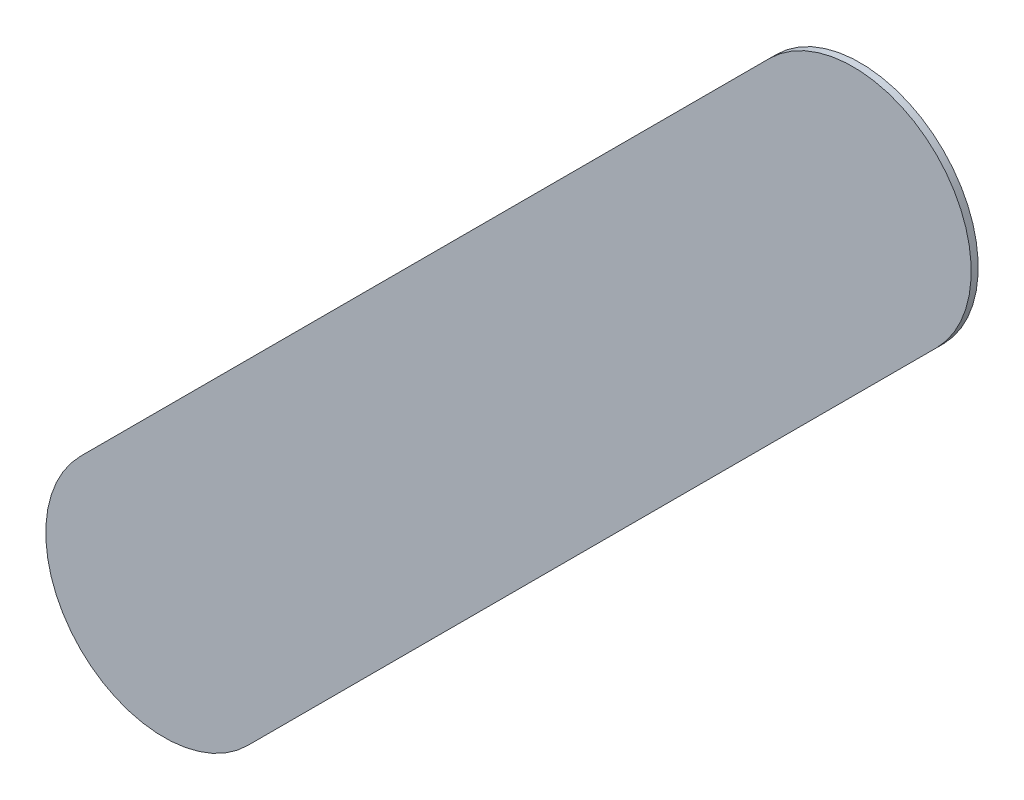
ISO-10303-21;
HEADER;
FILE_DESCRIPTION(('STEP AP214'),'2;1');
FILE_NAME('part.step','',(''),(''),'','','');
FILE_SCHEMA(('AUTOMOTIVE_DESIGN { 1 0 10303 214 1 1 1 1 }'));
ENDSEC;
DATA;
#1=APPLICATION_CONTEXT('core data for automotive mechanical design processes');
#2=APPLICATION_PROTOCOL_DEFINITION('international standard','automotive_design',2000,#1);
#3=PRODUCT_CONTEXT('',#1,'mechanical');
#4=PRODUCT('Part','Part','',(#3));
#5=PRODUCT_RELATED_PRODUCT_CATEGORY('part','',(#4));
#6=PRODUCT_DEFINITION_FORMATION('','',#4);
#7=PRODUCT_DEFINITION_CONTEXT('part definition',#1,'design');
#8=PRODUCT_DEFINITION('design','',#6,#7);
#9=PRODUCT_DEFINITION_SHAPE('','',#8);
#10=(LENGTH_UNIT() NAMED_UNIT(*) SI_UNIT(.MILLI.,.METRE.));
#11=(NAMED_UNIT(*) PLANE_ANGLE_UNIT() SI_UNIT($,.RADIAN.));
#12=(NAMED_UNIT(*) SI_UNIT($,.STERADIAN.) SOLID_ANGLE_UNIT());
#13=UNCERTAINTY_MEASURE_WITH_UNIT(LENGTH_MEASURE(1.E-05),#10,'distance_accuracy_value','');
#14=(GEOMETRIC_REPRESENTATION_CONTEXT(3) GLOBAL_UNCERTAINTY_ASSIGNED_CONTEXT((#13)) GLOBAL_UNIT_ASSIGNED_CONTEXT((#10,
#11,#12)) REPRESENTATION_CONTEXT('',''));
#15=CARTESIAN_POINT('',(0.,0.,0.));
#16=DIRECTION('',(0.,0.,1.));
#17=DIRECTION('',(1.,0.,0.));
#18=AXIS2_PLACEMENT_3D('',#15,#16,#17);
#19=CARTESIAN_POINT('',(38.32425914,116.57575364,0.));
#20=DIRECTION('',(-0.707101393003524,0.707112169328513,0.));
#21=DIRECTION('',(0.707112169328513,0.707101393003524,0.));
#22=AXIS2_PLACEMENT_3D('',#19,#20,#21);
#23=PLANE('',#22);
#24=DIRECTION('',(0.707112169328513,0.707101393003524,0.));
#25=VECTOR('',#24,1.);
#26=CARTESIAN_POINT('',(38.32425914,116.57575364,0.03556));
#27=LINE('',#26,#25);
#28=CARTESIAN_POINT('',(38.32425914,116.57575364,0.03556));
#29=VERTEX_POINT('',#28);
#30=CARTESIAN_POINT('',(41.82428008,120.07572124,0.03556));
#31=VERTEX_POINT('',#30);
#32=EDGE_CURVE('E11',#29,#31,#27,.T.);
#33=ORIENTED_EDGE('',*,*,#32,.F.);
#34=DIRECTION('',(0.,0.,1.));
#35=VECTOR('',#34,1.);
#36=CARTESIAN_POINT('',(38.32425914,116.57575364,0.));
#37=LINE('',#36,#35);
#38=CARTESIAN_POINT('',(38.32425914,116.57575364,0.));
#39=VERTEX_POINT('',#38);
#40=EDGE_CURVE('E24',#39,#29,#37,.T.);
#41=ORIENTED_EDGE('',*,*,#40,.F.);
#42=DIRECTION('',(0.707112169328513,0.707101393003524,0.));
#43=VECTOR('',#42,1.);
#44=CARTESIAN_POINT('',(38.32425914,116.57575364,0.));
#45=LINE('',#44,#43);
#46=CARTESIAN_POINT('',(41.82428008,120.07572124,0.));
#47=VERTEX_POINT('',#46);
#48=EDGE_CURVE('E75',#39,#47,#45,.T.);
#49=ORIENTED_EDGE('',*,*,#48,.T.);
#50=DIRECTION('',(0.,0.,1.));
#51=VECTOR('',#50,1.);
#52=CARTESIAN_POINT('',(41.82428008,120.07572124,0.));
#53=LINE('',#52,#51);
#54=EDGE_CURVE('E37',#47,#31,#53,.T.);
#55=ORIENTED_EDGE('',*,*,#54,.T.);
#56=EDGE_LOOP('',(#33,#41,#49,#55));
#57=FACE_BOUND('',#56,.T.);
#58=ADVANCED_FACE('F17',(#57),#23,.F.);
#59=CARTESIAN_POINT('',(41.4000200699924,120.499987599992,0.));
#60=DIRECTION('',(0.,0.,-1.));
#61=DIRECTION('',(0.707101489501725,-0.70711207283177,0.));
#62=AXIS2_PLACEMENT_3D('',#59,#60,#61);
#63=CYLINDRICAL_SURFACE('',#62,0.599998750259414);
#64=CARTESIAN_POINT('',(41.4000200699924,120.499987599992,0.03556));
#65=DIRECTION('',(0.,0.,1.));
#66=DIRECTION('',(0.707101489501725,-0.70711207283177,0.));
#67=AXIS2_PLACEMENT_3D('',#64,#65,#66);
#68=CIRCLE('',#67,0.599998750259414);
#69=CARTESIAN_POINT('',(40.97576006,120.92425396,0.03556));
#70=VERTEX_POINT('',#69);
#71=EDGE_CURVE('E83',#31,#70,#68,.T.);
#72=ORIENTED_EDGE('',*,*,#71,.F.);
#73=ORIENTED_EDGE('',*,*,#54,.F.);
#74=CARTESIAN_POINT('',(41.4000200699924,120.499987599992,0.));
#75=DIRECTION('',(0.,0.,1.));
#76=DIRECTION('',(0.707101489501725,-0.70711207283177,0.));
#77=AXIS2_PLACEMENT_3D('',#74,#75,#76);
#78=CIRCLE('',#77,0.599998750259414);
#79=CARTESIAN_POINT('',(40.97576006,120.92425396,0.));
#80=VERTEX_POINT('',#79);
#81=EDGE_CURVE('E81',#47,#80,#78,.T.);
#82=ORIENTED_EDGE('',*,*,#81,.T.);
#83=DIRECTION('',(0.,0.,1.));
#84=VECTOR('',#83,1.);
#85=CARTESIAN_POINT('',(40.97576006,120.92425396,0.));
#86=LINE('',#85,#84);
#87=EDGE_CURVE('E67',#80,#70,#86,.T.);
#88=ORIENTED_EDGE('',*,*,#87,.T.);
#89=EDGE_LOOP('',(#72,#73,#82,#88));
#90=FACE_BOUND('',#89,.T.);
#91=ADVANCED_FACE('F89',(#90),#63,.T.);
#92=CARTESIAN_POINT('',(40.97576006,120.92425396,0.));
#93=DIRECTION('',(0.707101393003524,-0.707112169328513,0.));
#94=DIRECTION('',(-0.707112169328513,-0.707101393003524,0.));
#95=AXIS2_PLACEMENT_3D('',#92,#93,#94);
#96=PLANE('',#95);
#97=DIRECTION('',(-0.707112169328513,-0.707101393003524,0.));
#98=VECTOR('',#97,1.);
#99=CARTESIAN_POINT('',(40.97576006,120.92425396,0.03556));
#100=LINE('',#99,#98);
#101=CARTESIAN_POINT('',(37.47573912,117.42428636,0.03556));
#102=VERTEX_POINT('',#101);
#103=EDGE_CURVE('E71',#70,#102,#100,.T.);
#104=ORIENTED_EDGE('',*,*,#103,.F.);
#105=ORIENTED_EDGE('',*,*,#87,.F.);
#106=DIRECTION('',(-0.707112169328513,-0.707101393003524,0.));
#107=VECTOR('',#106,1.);
#108=CARTESIAN_POINT('',(40.97576006,120.92425396,0.));
#109=LINE('',#108,#107);
#110=CARTESIAN_POINT('',(37.47573912,117.42428636,0.));
#111=VERTEX_POINT('',#110);
#112=EDGE_CURVE('E63',#80,#111,#109,.T.);
#113=ORIENTED_EDGE('',*,*,#112,.T.);
#114=DIRECTION('',(0.,0.,1.));
#115=VECTOR('',#114,1.);
#116=CARTESIAN_POINT('',(37.47573912,117.42428636,0.));
#117=LINE('',#116,#115);
#118=EDGE_CURVE('E53',#111,#102,#117,.T.);
#119=ORIENTED_EDGE('',*,*,#118,.T.);
#120=EDGE_LOOP('',(#104,#105,#113,#119));
#121=FACE_BOUND('',#120,.T.);
#122=ADVANCED_FACE('F66',(#121),#96,.F.);
#123=CARTESIAN_POINT('',(37.8999991300076,117.000020000008,0.));
#124=DIRECTION('',(0.,0.,-1.));
#125=DIRECTION('',(-0.70710148950173,0.707112072831764,0.));
#126=AXIS2_PLACEMENT_3D('',#123,#124,#125);
#127=CYLINDRICAL_SURFACE('',#126,0.599998750259414);
#128=CARTESIAN_POINT('',(37.8999991300076,117.000020000008,0.03556));
#129=DIRECTION('',(0.,0.,1.));
#130=DIRECTION('',(-0.70710148950173,0.707112072831764,0.));
#131=AXIS2_PLACEMENT_3D('',#128,#129,#130);
#132=CIRCLE('',#131,0.599998750259414);
#133=EDGE_CURVE('E59',#102,#29,#132,.T.);
#134=ORIENTED_EDGE('',*,*,#133,.F.);
#135=ORIENTED_EDGE('',*,*,#118,.F.);
#136=CARTESIAN_POINT('',(37.8999991300076,117.000020000008,0.));
#137=DIRECTION('',(0.,0.,1.));
#138=DIRECTION('',(-0.70710148950173,0.707112072831764,0.));
#139=AXIS2_PLACEMENT_3D('',#136,#137,#138);
#140=CIRCLE('',#139,0.599998750259414);
#141=EDGE_CURVE('E57',#111,#39,#140,.T.);
#142=ORIENTED_EDGE('',*,*,#141,.T.);
#143=ORIENTED_EDGE('',*,*,#40,.T.);
#144=EDGE_LOOP('',(#134,#135,#142,#143));
#145=FACE_BOUND('',#144,.T.);
#146=ADVANCED_FACE('F55',(#145),#127,.T.);
#147=CARTESIAN_POINT('',(38.32425914,116.57575364,0.));
#148=DIRECTION('',(0.,0.,-1.));
#149=DIRECTION('',(-1.,0.,0.));
#150=AXIS2_PLACEMENT_3D('',#147,#148,#149);
#151=PLANE('',#150);
#152=ORIENTED_EDGE('',*,*,#141,.F.);
#153=ORIENTED_EDGE('',*,*,#112,.F.);
#154=ORIENTED_EDGE('',*,*,#81,.F.);
#155=ORIENTED_EDGE('',*,*,#48,.F.);
#156=EDGE_LOOP('',(#152,#153,#154,#155));
#157=FACE_BOUND('',#156,.T.);
#158=ADVANCED_FACE('F74',(#157),#151,.T.);
#159=CARTESIAN_POINT('',(38.32425914,116.57575364,0.03556));
#160=DIRECTION('',(0.,0.,-1.));
#161=DIRECTION('',(-1.,0.,0.));
#162=AXIS2_PLACEMENT_3D('',#159,#160,#161);
#163=PLANE('',#162);
#164=ORIENTED_EDGE('',*,*,#32,.T.);
#165=ORIENTED_EDGE('',*,*,#71,.T.);
#166=ORIENTED_EDGE('',*,*,#103,.T.);
#167=ORIENTED_EDGE('',*,*,#133,.T.);
#168=EDGE_LOOP('',(#164,#165,#166,#167));
#169=FACE_BOUND('',#168,.T.);
#170=ADVANCED_FACE('F91',(#169),#163,.F.);
#171=CLOSED_SHELL('',(#58,#91,#122,#146,#158,#170));
#172=MANIFOLD_SOLID_BREP('B1',#171);
#173=ADVANCED_BREP_SHAPE_REPRESENTATION('',(#18,#172),#14);
#174=SHAPE_DEFINITION_REPRESENTATION(#9,#173);
ENDSEC;
END-ISO-10303-21;
